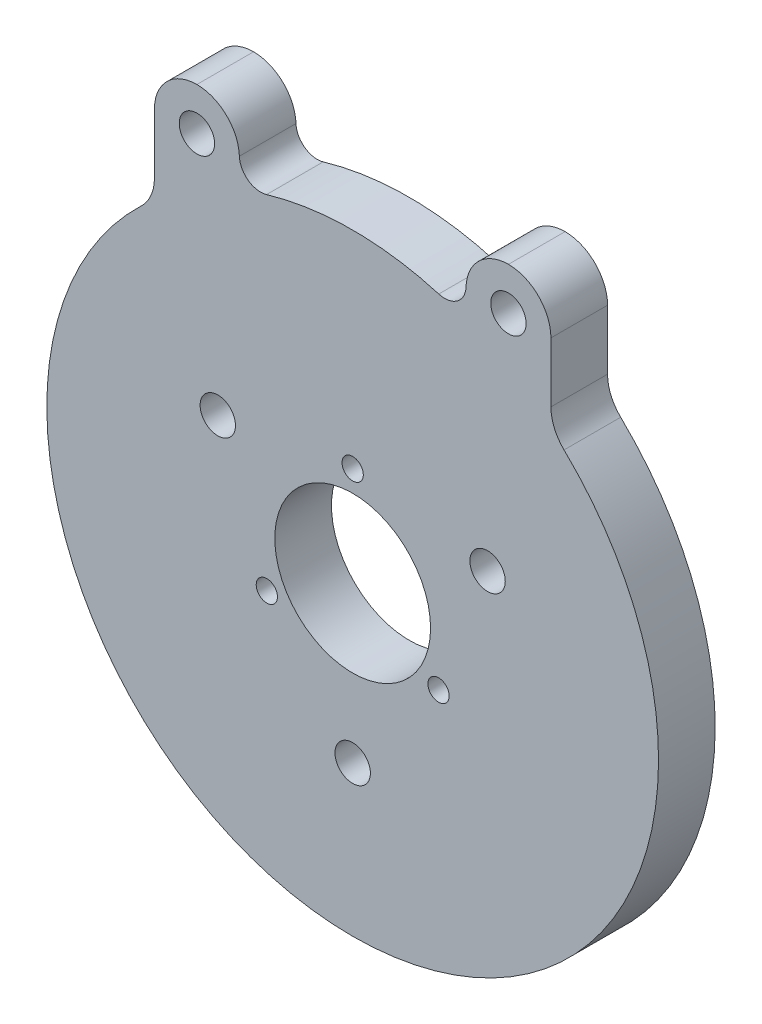
ISO-10303-21;
HEADER;
FILE_DESCRIPTION(('STEP AP214'),'2;1');
FILE_NAME('part.step','',(''),(''),'','','');
FILE_SCHEMA(('AUTOMOTIVE_DESIGN { 1 0 10303 214 1 1 1 1 }'));
ENDSEC;
DATA;
#1=APPLICATION_CONTEXT('core data for automotive mechanical design processes');
#2=APPLICATION_PROTOCOL_DEFINITION('international standard','automotive_design',2000,#1);
#3=PRODUCT_CONTEXT('',#1,'mechanical');
#4=PRODUCT('Part','Part','',(#3));
#5=PRODUCT_RELATED_PRODUCT_CATEGORY('part','',(#4));
#6=PRODUCT_DEFINITION_FORMATION('','',#4);
#7=PRODUCT_DEFINITION_CONTEXT('part definition',#1,'design');
#8=PRODUCT_DEFINITION('design','',#6,#7);
#9=PRODUCT_DEFINITION_SHAPE('','',#8);
#10=(LENGTH_UNIT() NAMED_UNIT(*) SI_UNIT(.MILLI.,.METRE.));
#11=(NAMED_UNIT(*) PLANE_ANGLE_UNIT() SI_UNIT($,.RADIAN.));
#12=(NAMED_UNIT(*) SI_UNIT($,.STERADIAN.) SOLID_ANGLE_UNIT());
#13=UNCERTAINTY_MEASURE_WITH_UNIT(LENGTH_MEASURE(1.E-05),#10,'distance_accuracy_value','');
#14=(GEOMETRIC_REPRESENTATION_CONTEXT(3) GLOBAL_UNCERTAINTY_ASSIGNED_CONTEXT((#13)) GLOBAL_UNIT_ASSIGNED_CONTEXT((#10,
#11,#12)) REPRESENTATION_CONTEXT('',''));
#15=CARTESIAN_POINT('',(0.,0.,0.));
#16=DIRECTION('',(0.,0.,1.));
#17=DIRECTION('',(1.,0.,0.));
#18=AXIS2_PLACEMENT_3D('',#15,#16,#17);
#19=CARTESIAN_POINT('',(0.,0.,4.));
#20=DIRECTION('',(0.,0.,-1.));
#21=DIRECTION('',(-1.,0.,0.));
#22=AXIS2_PLACEMENT_3D('',#19,#20,#21);
#23=CYLINDRICAL_SURFACE('',#22,21.6);
#24=CARTESIAN_POINT('',(0.,0.,0.));
#25=DIRECTION('',(0.,0.,1.));
#26=DIRECTION('',(1.,0.,0.));
#27=AXIS2_PLACEMENT_3D('',#24,#25,#26);
#28=CIRCLE('',#27,21.6);
#29=CARTESIAN_POINT('',(-14.9268292682927,15.6124875658955,0.));
#30=VERTEX_POINT('',#29);
#31=CARTESIAN_POINT('',(14.9268292682927,15.6124875658955,0.));
#32=VERTEX_POINT('',#31);
#33=EDGE_CURVE('E124',#30,#32,#28,.T.);
#34=ORIENTED_EDGE('',*,*,#33,.T.);
#35=DIRECTION('',(0.,0.,-1.));
#36=VECTOR('',#35,1.);
#37=CARTESIAN_POINT('',(14.9268292682927,15.6124875658955,4.));
#38=LINE('',#37,#36);
#39=CARTESIAN_POINT('',(14.9268292682927,15.6124875658955,4.));
#40=VERTEX_POINT('',#39);
#41=EDGE_CURVE('E130',#32,#40,#38,.F.);
#42=ORIENTED_EDGE('',*,*,#41,.T.);
#43=CARTESIAN_POINT('',(0.,0.,4.));
#44=DIRECTION('',(0.,0.,1.));
#45=DIRECTION('',(1.,0.,0.));
#46=AXIS2_PLACEMENT_3D('',#43,#44,#45);
#47=CIRCLE('',#46,21.6);
#48=CARTESIAN_POINT('',(-14.9268292682927,15.6124875658955,4.));
#49=VERTEX_POINT('',#48);
#50=EDGE_CURVE('E127',#49,#40,#47,.T.);
#51=ORIENTED_EDGE('',*,*,#50,.F.);
#52=DIRECTION('',(0.,0.,-1.));
#53=VECTOR('',#52,1.);
#54=CARTESIAN_POINT('',(-14.9268292682927,15.6124875658955,4.));
#55=LINE('',#54,#53);
#56=EDGE_CURVE('E121',#49,#30,#55,.T.);
#57=ORIENTED_EDGE('',*,*,#56,.T.);
#58=EDGE_LOOP('',(#34,#42,#51,#57));
#59=FACE_BOUND('',#58,.T.);
#60=ADVANCED_FACE('F32',(#59),#23,.T.);
#61=CARTESIAN_POINT('',(6.08077725305326,20.7264118457284,0.));
#62=VERTEX_POINT('',#61);
#63=CARTESIAN_POINT('',(-6.08077725305325,20.7264118457284,0.));
#64=VERTEX_POINT('',#63);
#65=EDGE_CURVE('E141',#62,#64,#28,.T.);
#66=ORIENTED_EDGE('',*,*,#65,.T.);
#67=DIRECTION('',(0.,0.,-1.));
#68=VECTOR('',#67,1.);
#69=CARTESIAN_POINT('',(-6.08077725305325,20.7264118457284,4.));
#70=LINE('',#69,#68);
#71=CARTESIAN_POINT('',(-6.08077725305325,20.7264118457284,4.));
#72=VERTEX_POINT('',#71);
#73=EDGE_CURVE('E151',#64,#72,#70,.F.);
#74=ORIENTED_EDGE('',*,*,#73,.T.);
#75=CARTESIAN_POINT('',(6.08077725305326,20.7264118457284,4.));
#76=VERTEX_POINT('',#75);
#77=EDGE_CURVE('E131',#76,#72,#47,.T.);
#78=ORIENTED_EDGE('',*,*,#77,.F.);
#79=DIRECTION('',(0.,0.,-1.));
#80=VECTOR('',#79,1.);
#81=CARTESIAN_POINT('',(6.08077725305326,20.7264118457284,4.));
#82=LINE('',#81,#80);
#83=EDGE_CURVE('E148',#76,#62,#82,.T.);
#84=ORIENTED_EDGE('',*,*,#83,.T.);
#85=EDGE_LOOP('',(#66,#74,#78,#84));
#86=FACE_BOUND('',#85,.T.);
#87=ADVANCED_FACE('F184',(#86),#23,.T.);
#88=CARTESIAN_POINT('',(0.,0.,4.));
#89=DIRECTION('',(0.,0.,1.));
#90=DIRECTION('',(1.,0.,0.));
#91=AXIS2_PLACEMENT_3D('',#88,#89,#90);
#92=PLANE('',#91);
#93=CARTESIAN_POINT('',(-9.52627944162887,5.49999999999991,4.));
#94=DIRECTION('',(0.,0.,1.));
#95=DIRECTION('',(-0.499999999999992,-0.866025403784443,0.));
#96=AXIS2_PLACEMENT_3D('',#93,#94,#95);
#97=CIRCLE('',#96,1.25);
#98=CARTESIAN_POINT('',(-10.1512794416289,4.41746824526936,4.));
#99=VERTEX_POINT('',#98);
#100=EDGE_CURVE('E298',#99,#99,#97,.T.);
#101=ORIENTED_EDGE('',*,*,#100,.F.);
#102=EDGE_LOOP('',(#101));
#103=FACE_BOUND('',#102,.T.);
#104=CARTESIAN_POINT('',(9.5262794416288,5.50000000000004,4.));
#105=DIRECTION('',(0.,0.,1.));
#106=DIRECTION('',(-0.500000000000004,0.866025403784436,0.));
#107=AXIS2_PLACEMENT_3D('',#104,#105,#106);
#108=CIRCLE('',#107,1.25);
#109=CARTESIAN_POINT('',(8.9012794416288,6.58253175473059,4.));
#110=VERTEX_POINT('',#109);
#111=EDGE_CURVE('E292',#110,#110,#108,.T.);
#112=ORIENTED_EDGE('',*,*,#111,.F.);
#113=EDGE_LOOP('',(#112));
#114=FACE_BOUND('',#113,.T.);
#115=CARTESIAN_POINT('',(0.,-11.,4.));
#116=DIRECTION('',(0.,0.,1.));
#117=DIRECTION('',(1.,0.,0.));
#118=AXIS2_PLACEMENT_3D('',#115,#116,#117);
#119=CIRCLE('',#118,1.25);
#120=CARTESIAN_POINT('',(1.25,-11.,4.));
#121=VERTEX_POINT('',#120);
#122=EDGE_CURVE('E286',#121,#121,#119,.T.);
#123=ORIENTED_EDGE('',*,*,#122,.F.);
#124=EDGE_LOOP('',(#123));
#125=FACE_BOUND('',#124,.T.);
#126=CARTESIAN_POINT('',(6.0621778264911,-3.49999999999994,4.));
#127=DIRECTION('',(0.,0.,1.));
#128=DIRECTION('',(-0.499999999999992,-0.866025403784443,0.));
#129=AXIS2_PLACEMENT_3D('',#126,#127,#128);
#130=CIRCLE('',#129,0.75);
#131=CARTESIAN_POINT('',(6.8121778264911,-3.49999999999994,4.));
#132=VERTEX_POINT('',#131);
#133=EDGE_CURVE('E280',#132,#132,#130,.T.);
#134=ORIENTED_EDGE('',*,*,#133,.F.);
#135=EDGE_LOOP('',(#134));
#136=FACE_BOUND('',#135,.T.);
#137=CARTESIAN_POINT('',(-6.06217782649106,-3.50000000000003,4.));
#138=DIRECTION('',(0.,0.,1.));
#139=DIRECTION('',(-0.500000000000004,0.866025403784436,0.));
#140=AXIS2_PLACEMENT_3D('',#137,#138,#139);
#141=CIRCLE('',#140,0.75);
#142=CARTESIAN_POINT('',(-5.31217782649106,-3.50000000000003,4.));
#143=VERTEX_POINT('',#142);
#144=EDGE_CURVE('E274',#143,#143,#141,.T.);
#145=ORIENTED_EDGE('',*,*,#144,.F.);
#146=EDGE_LOOP('',(#145));
#147=FACE_BOUND('',#146,.T.);
#148=CARTESIAN_POINT('',(0.,7.,4.));
#149=DIRECTION('',(0.,0.,1.));
#150=DIRECTION('',(1.,0.,0.));
#151=AXIS2_PLACEMENT_3D('',#148,#149,#150);
#152=CIRCLE('',#151,0.75);
#153=CARTESIAN_POINT('',(0.75,7.,4.));
#154=VERTEX_POINT('',#153);
#155=EDGE_CURVE('E268',#154,#154,#152,.T.);
#156=ORIENTED_EDGE('',*,*,#155,.F.);
#157=EDGE_LOOP('',(#156));
#158=FACE_BOUND('',#157,.T.);
#159=CARTESIAN_POINT('',(0.,0.,4.));
#160=DIRECTION('',(0.,0.,1.));
#161=DIRECTION('',(1.,0.,0.));
#162=AXIS2_PLACEMENT_3D('',#159,#160,#161);
#163=CIRCLE('',#162,5.5);
#164=CARTESIAN_POINT('',(5.5,0.,4.));
#165=VERTEX_POINT('',#164);
#166=EDGE_CURVE('E262',#165,#165,#163,.T.);
#167=ORIENTED_EDGE('',*,*,#166,.F.);
#168=EDGE_LOOP('',(#167));
#169=FACE_BOUND('',#168,.T.);
#170=DIRECTION('',(0.,-1.,0.));
#171=VECTOR('',#170,1.);
#172=CARTESIAN_POINT('',(14.,-48.4149446548446,4.));
#173=LINE('',#172,#171);
#174=CARTESIAN_POINT('',(14.,21.9999999999999,4.));
#175=VERTEX_POINT('',#174);
#176=CARTESIAN_POINT('',(14.,17.7808886167143,4.));
#177=VERTEX_POINT('',#176);
#178=EDGE_CURVE('E203',#175,#177,#173,.T.);
#179=ORIENTED_EDGE('',*,*,#178,.F.);
#180=CARTESIAN_POINT('',(11.,21.9999999999999,4.));
#181=DIRECTION('',(0.,0.,1.));
#182=DIRECTION('',(1.,0.,0.));
#183=AXIS2_PLACEMENT_3D('',#180,#181,#182);
#184=CIRCLE('',#183,3.);
#185=CARTESIAN_POINT('',(11.,24.9999999999999,4.));
#186=VERTEX_POINT('',#185);
#187=EDGE_CURVE('E229',#175,#186,#184,.T.);
#188=ORIENTED_EDGE('',*,*,#187,.T.);
#189=CARTESIAN_POINT('',(11.,21.9999999999999,4.));
#190=DIRECTION('',(0.,0.,1.));
#191=DIRECTION('',(1.,0.,0.));
#192=AXIS2_PLACEMENT_3D('',#189,#190,#191);
#193=CIRCLE('',#192,3.);
#194=CARTESIAN_POINT('',(8.00203563412131,22.1104973344545,4.));
#195=VERTEX_POINT('',#194);
#196=EDGE_CURVE('E181',#186,#195,#193,.T.);
#197=ORIENTED_EDGE('',*,*,#196,.T.);
#198=CARTESIAN_POINT('',(6.50305345118196,22.1657460016818,4.));
#199=DIRECTION('',(0.,0.,1.));
#200=DIRECTION('',(1.,0.,0.));
#201=AXIS2_PLACEMENT_3D('',#198,#199,#200);
#202=CIRCLE('',#201,1.5);
#203=EDGE_CURVE('E40',#195,#76,#202,.F.);
#204=ORIENTED_EDGE('',*,*,#203,.T.);
#205=ORIENTED_EDGE('',*,*,#77,.T.);
#206=CARTESIAN_POINT('',(-6.50305345118195,22.1657460016818,4.));
#207=DIRECTION('',(0.,0.,1.));
#208=DIRECTION('',(1.,0.,0.));
#209=AXIS2_PLACEMENT_3D('',#206,#207,#208);
#210=CIRCLE('',#209,1.5);
#211=CARTESIAN_POINT('',(-8.0020356341213,22.1104973344545,4.));
#212=VERTEX_POINT('',#211);
#213=EDGE_CURVE('E170',#72,#212,#210,.F.);
#214=ORIENTED_EDGE('',*,*,#213,.T.);
#215=CARTESIAN_POINT('',(-11.,21.9999999999999,4.));
#216=DIRECTION('',(0.,0.,1.));
#217=DIRECTION('',(1.,0.,0.));
#218=AXIS2_PLACEMENT_3D('',#215,#216,#217);
#219=CIRCLE('',#218,3.);
#220=CARTESIAN_POINT('',(-11.,24.9999999999999,4.));
#221=VERTEX_POINT('',#220);
#222=EDGE_CURVE('E226',#212,#221,#219,.T.);
#223=ORIENTED_EDGE('',*,*,#222,.T.);
#224=CARTESIAN_POINT('',(-11.,21.9999999999999,4.));
#225=DIRECTION('',(0.,0.,1.));
#226=DIRECTION('',(1.,0.,0.));
#227=AXIS2_PLACEMENT_3D('',#224,#225,#226);
#228=CIRCLE('',#227,3.);
#229=CARTESIAN_POINT('',(-14.,21.9999999999999,4.));
#230=VERTEX_POINT('',#229);
#231=EDGE_CURVE('E224',#221,#230,#228,.T.);
#232=ORIENTED_EDGE('',*,*,#231,.T.);
#233=DIRECTION('',(0.,1.,0.));
#234=VECTOR('',#233,1.);
#235=CARTESIAN_POINT('',(-14.,-48.4149446548446,4.));
#236=LINE('',#235,#234);
#237=CARTESIAN_POINT('',(-14.,17.7808886167143,4.));
#238=VERTEX_POINT('',#237);
#239=EDGE_CURVE('E252',#238,#230,#236,.T.);
#240=ORIENTED_EDGE('',*,*,#239,.F.);
#241=CARTESIAN_POINT('',(-17.,17.7808886167143,4.));
#242=DIRECTION('',(0.,0.,1.));
#243=DIRECTION('',(1.,0.,0.));
#244=AXIS2_PLACEMENT_3D('',#241,#242,#243);
#245=CIRCLE('',#244,3.);
#246=EDGE_CURVE('E149',#238,#49,#245,.F.);
#247=ORIENTED_EDGE('',*,*,#246,.T.);
#248=ORIENTED_EDGE('',*,*,#50,.T.);
#249=CARTESIAN_POINT('',(17.,17.7808886167143,4.));
#250=DIRECTION('',(0.,0.,1.));
#251=DIRECTION('',(1.,0.,0.));
#252=AXIS2_PLACEMENT_3D('',#249,#250,#251);
#253=CIRCLE('',#252,3.);
#254=EDGE_CURVE('E195',#40,#177,#253,.F.);
#255=ORIENTED_EDGE('',*,*,#254,.T.);
#256=EDGE_LOOP('',(#179,#188,#197,#204,#205,#214,#223,#232,#240,#247,#248,#255));
#257=FACE_BOUND('',#256,.T.);
#258=CARTESIAN_POINT('',(11.,21.9999999999999,4.));
#259=DIRECTION('',(0.,0.,1.));
#260=DIRECTION('',(1.,0.,0.));
#261=AXIS2_PLACEMENT_3D('',#258,#259,#260);
#262=CIRCLE('',#261,1.25);
#263=CARTESIAN_POINT('',(12.25,21.9999999999999,4.));
#264=VERTEX_POINT('',#263);
#265=EDGE_CURVE('E142',#264,#264,#262,.T.);
#266=ORIENTED_EDGE('',*,*,#265,.F.);
#267=EDGE_LOOP('',(#266));
#268=FACE_BOUND('',#267,.T.);
#269=CARTESIAN_POINT('',(-11.,21.9999999999999,4.));
#270=DIRECTION('',(0.,0.,1.));
#271=DIRECTION('',(1.,0.,0.));
#272=AXIS2_PLACEMENT_3D('',#269,#270,#271);
#273=CIRCLE('',#272,1.25);
#274=CARTESIAN_POINT('',(-9.74999999999999,21.9999999999999,4.));
#275=VERTEX_POINT('',#274);
#276=EDGE_CURVE('E159',#275,#275,#273,.T.);
#277=ORIENTED_EDGE('',*,*,#276,.F.);
#278=EDGE_LOOP('',(#277));
#279=FACE_BOUND('',#278,.T.);
#280=ADVANCED_FACE('F178',(#103,#114,#125,#136,#147,#158,#169,#257,#268,#279),#92,.T.);
#281=CARTESIAN_POINT('',(0.,0.,0.));
#282=DIRECTION('',(0.,0.,1.));
#283=DIRECTION('',(1.,0.,0.));
#284=AXIS2_PLACEMENT_3D('',#281,#282,#283);
#285=PLANE('',#284);
#286=CARTESIAN_POINT('',(-9.52627944162887,5.49999999999991,0.));
#287=DIRECTION('',(0.,0.,1.));
#288=DIRECTION('',(1.,0.,0.));
#289=AXIS2_PLACEMENT_3D('',#286,#287,#288);
#290=CIRCLE('',#289,1.25);
#291=CARTESIAN_POINT('',(-8.27627944162887,5.49999999999991,0.));
#292=VERTEX_POINT('',#291);
#293=EDGE_CURVE('E295',#292,#292,#290,.F.);
#294=ORIENTED_EDGE('',*,*,#293,.F.);
#295=EDGE_LOOP('',(#294));
#296=FACE_BOUND('',#295,.T.);
#297=CARTESIAN_POINT('',(9.5262794416288,5.50000000000004,0.));
#298=DIRECTION('',(0.,0.,1.));
#299=DIRECTION('',(1.,0.,0.));
#300=AXIS2_PLACEMENT_3D('',#297,#298,#299);
#301=CIRCLE('',#300,1.25);
#302=CARTESIAN_POINT('',(10.7762794416288,5.50000000000004,0.));
#303=VERTEX_POINT('',#302);
#304=EDGE_CURVE('E289',#303,#303,#301,.F.);
#305=ORIENTED_EDGE('',*,*,#304,.F.);
#306=EDGE_LOOP('',(#305));
#307=FACE_BOUND('',#306,.T.);
#308=CARTESIAN_POINT('',(0.,-11.,0.));
#309=DIRECTION('',(0.,0.,1.));
#310=DIRECTION('',(1.,0.,0.));
#311=AXIS2_PLACEMENT_3D('',#308,#309,#310);
#312=CIRCLE('',#311,1.25);
#313=CARTESIAN_POINT('',(1.25,-11.,0.));
#314=VERTEX_POINT('',#313);
#315=EDGE_CURVE('E283',#314,#314,#312,.F.);
#316=ORIENTED_EDGE('',*,*,#315,.F.);
#317=EDGE_LOOP('',(#316));
#318=FACE_BOUND('',#317,.T.);
#319=CARTESIAN_POINT('',(6.0621778264911,-3.49999999999994,0.));
#320=DIRECTION('',(0.,0.,1.));
#321=DIRECTION('',(1.,0.,0.));
#322=AXIS2_PLACEMENT_3D('',#319,#320,#321);
#323=CIRCLE('',#322,0.75);
#324=CARTESIAN_POINT('',(6.8121778264911,-3.49999999999994,0.));
#325=VERTEX_POINT('',#324);
#326=EDGE_CURVE('E277',#325,#325,#323,.F.);
#327=ORIENTED_EDGE('',*,*,#326,.F.);
#328=EDGE_LOOP('',(#327));
#329=FACE_BOUND('',#328,.T.);
#330=CARTESIAN_POINT('',(-6.06217782649106,-3.50000000000003,0.));
#331=DIRECTION('',(0.,0.,1.));
#332=DIRECTION('',(1.,0.,0.));
#333=AXIS2_PLACEMENT_3D('',#330,#331,#332);
#334=CIRCLE('',#333,0.75);
#335=CARTESIAN_POINT('',(-5.31217782649106,-3.50000000000003,0.));
#336=VERTEX_POINT('',#335);
#337=EDGE_CURVE('E271',#336,#336,#334,.F.);
#338=ORIENTED_EDGE('',*,*,#337,.F.);
#339=EDGE_LOOP('',(#338));
#340=FACE_BOUND('',#339,.T.);
#341=CARTESIAN_POINT('',(0.,7.,0.));
#342=DIRECTION('',(0.,0.,1.));
#343=DIRECTION('',(1.,0.,0.));
#344=AXIS2_PLACEMENT_3D('',#341,#342,#343);
#345=CIRCLE('',#344,0.75);
#346=CARTESIAN_POINT('',(0.75,7.,0.));
#347=VERTEX_POINT('',#346);
#348=EDGE_CURVE('E265',#347,#347,#345,.F.);
#349=ORIENTED_EDGE('',*,*,#348,.F.);
#350=EDGE_LOOP('',(#349));
#351=FACE_BOUND('',#350,.T.);
#352=CARTESIAN_POINT('',(0.,0.,0.));
#353=DIRECTION('',(0.,0.,1.));
#354=DIRECTION('',(1.,0.,0.));
#355=AXIS2_PLACEMENT_3D('',#352,#353,#354);
#356=CIRCLE('',#355,5.5);
#357=CARTESIAN_POINT('',(5.5,0.,0.));
#358=VERTEX_POINT('',#357);
#359=EDGE_CURVE('E162',#358,#358,#356,.F.);
#360=ORIENTED_EDGE('',*,*,#359,.F.);
#361=EDGE_LOOP('',(#360));
#362=FACE_BOUND('',#361,.T.);
#363=ORIENTED_EDGE('',*,*,#65,.F.);
#364=CARTESIAN_POINT('',(6.50305345118196,22.1657460016818,0.));
#365=DIRECTION('',(0.,0.,1.));
#366=DIRECTION('',(1.,0.,0.));
#367=AXIS2_PLACEMENT_3D('',#364,#365,#366);
#368=CIRCLE('',#367,1.5);
#369=CARTESIAN_POINT('',(8.00203563412131,22.1104973344545,0.));
#370=VERTEX_POINT('',#369);
#371=EDGE_CURVE('E11',#62,#370,#368,.T.);
#372=ORIENTED_EDGE('',*,*,#371,.T.);
#373=CARTESIAN_POINT('',(11.,21.9999999999999,0.));
#374=DIRECTION('',(0.,0.,1.));
#375=DIRECTION('',(1.,0.,0.));
#376=AXIS2_PLACEMENT_3D('',#373,#374,#375);
#377=CIRCLE('',#376,3.);
#378=CARTESIAN_POINT('',(11.,24.9999999999999,0.));
#379=VERTEX_POINT('',#378);
#380=EDGE_CURVE('E190',#370,#379,#377,.F.);
#381=ORIENTED_EDGE('',*,*,#380,.T.);
#382=CARTESIAN_POINT('',(11.,21.9999999999999,0.));
#383=DIRECTION('',(0.,0.,1.));
#384=DIRECTION('',(1.,0.,0.));
#385=AXIS2_PLACEMENT_3D('',#382,#383,#384);
#386=CIRCLE('',#385,3.);
#387=CARTESIAN_POINT('',(14.,21.9999999999999,0.));
#388=VERTEX_POINT('',#387);
#389=EDGE_CURVE('E192',#379,#388,#386,.F.);
#390=ORIENTED_EDGE('',*,*,#389,.T.);
#391=DIRECTION('',(0.,1.,0.));
#392=VECTOR('',#391,1.);
#393=CARTESIAN_POINT('',(14.,-48.4149446548446,0.));
#394=LINE('',#393,#392);
#395=CARTESIAN_POINT('',(14.,17.7808886167143,0.));
#396=VERTEX_POINT('',#395);
#397=EDGE_CURVE('E214',#396,#388,#394,.T.);
#398=ORIENTED_EDGE('',*,*,#397,.F.);
#399=CARTESIAN_POINT('',(17.,17.7808886167143,0.));
#400=DIRECTION('',(0.,0.,1.));
#401=DIRECTION('',(1.,0.,0.));
#402=AXIS2_PLACEMENT_3D('',#399,#400,#401);
#403=CIRCLE('',#402,3.);
#404=EDGE_CURVE('E140',#396,#32,#403,.T.);
#405=ORIENTED_EDGE('',*,*,#404,.T.);
#406=ORIENTED_EDGE('',*,*,#33,.F.);
#407=CARTESIAN_POINT('',(-17.,17.7808886167143,0.));
#408=DIRECTION('',(0.,0.,1.));
#409=DIRECTION('',(1.,0.,0.));
#410=AXIS2_PLACEMENT_3D('',#407,#408,#409);
#411=CIRCLE('',#410,3.);
#412=CARTESIAN_POINT('',(-14.,17.7808886167143,0.));
#413=VERTEX_POINT('',#412);
#414=EDGE_CURVE('E136',#30,#413,#411,.T.);
#415=ORIENTED_EDGE('',*,*,#414,.T.);
#416=DIRECTION('',(0.,-1.,0.));
#417=VECTOR('',#416,1.);
#418=CARTESIAN_POINT('',(-14.,-48.4149446548446,0.));
#419=LINE('',#418,#417);
#420=CARTESIAN_POINT('',(-14.,21.9999999999999,0.));
#421=VERTEX_POINT('',#420);
#422=EDGE_CURVE('E234',#421,#413,#419,.T.);
#423=ORIENTED_EDGE('',*,*,#422,.F.);
#424=CARTESIAN_POINT('',(-11.,21.9999999999999,0.));
#425=DIRECTION('',(0.,0.,1.));
#426=DIRECTION('',(1.,0.,0.));
#427=AXIS2_PLACEMENT_3D('',#424,#425,#426);
#428=CIRCLE('',#427,3.);
#429=CARTESIAN_POINT('',(-11.,24.9999999999999,0.));
#430=VERTEX_POINT('',#429);
#431=EDGE_CURVE('E198',#421,#430,#428,.F.);
#432=ORIENTED_EDGE('',*,*,#431,.T.);
#433=CARTESIAN_POINT('',(-11.,21.9999999999999,0.));
#434=DIRECTION('',(0.,0.,1.));
#435=DIRECTION('',(1.,0.,0.));
#436=AXIS2_PLACEMENT_3D('',#433,#434,#435);
#437=CIRCLE('',#436,3.);
#438=CARTESIAN_POINT('',(-8.0020356341213,22.1104973344545,0.));
#439=VERTEX_POINT('',#438);
#440=EDGE_CURVE('E193',#430,#439,#437,.F.);
#441=ORIENTED_EDGE('',*,*,#440,.T.);
#442=CARTESIAN_POINT('',(-6.50305345118195,22.1657460016818,0.));
#443=DIRECTION('',(0.,0.,1.));
#444=DIRECTION('',(1.,0.,0.));
#445=AXIS2_PLACEMENT_3D('',#442,#443,#444);
#446=CIRCLE('',#445,1.5);
#447=EDGE_CURVE('E172',#439,#64,#446,.T.);
#448=ORIENTED_EDGE('',*,*,#447,.T.);
#449=EDGE_LOOP('',(#363,#372,#381,#390,#398,#405,#406,#415,#423,#432,#441,#448));
#450=FACE_BOUND('',#449,.T.);
#451=CARTESIAN_POINT('',(11.,21.9999999999999,0.));
#452=DIRECTION('',(0.,0.,1.));
#453=DIRECTION('',(1.,0.,0.));
#454=AXIS2_PLACEMENT_3D('',#451,#452,#453);
#455=CIRCLE('',#454,1.25);
#456=CARTESIAN_POINT('',(12.25,21.9999999999999,0.));
#457=VERTEX_POINT('',#456);
#458=EDGE_CURVE('E213',#457,#457,#455,.F.);
#459=ORIENTED_EDGE('',*,*,#458,.F.);
#460=EDGE_LOOP('',(#459));
#461=FACE_BOUND('',#460,.T.);
#462=CARTESIAN_POINT('',(-11.,21.9999999999999,0.));
#463=DIRECTION('',(0.,0.,1.));
#464=DIRECTION('',(1.,0.,0.));
#465=AXIS2_PLACEMENT_3D('',#462,#463,#464);
#466=CIRCLE('',#465,1.25);
#467=CARTESIAN_POINT('',(-9.74999999999999,21.9999999999999,0.));
#468=VERTEX_POINT('',#467);
#469=EDGE_CURVE('E247',#468,#468,#466,.F.);
#470=ORIENTED_EDGE('',*,*,#469,.F.);
#471=EDGE_LOOP('',(#470));
#472=FACE_BOUND('',#471,.T.);
#473=ADVANCED_FACE('F133',(#296,#307,#318,#329,#340,#351,#362,#450,#461,#472),#285,.F.);
#474=CARTESIAN_POINT('',(14.,-48.4149446548446,-10.4462716890724));
#475=DIRECTION('',(-1.,0.,0.));
#476=DIRECTION('',(0.,-1.,0.));
#477=AXIS2_PLACEMENT_3D('',#474,#475,#476);
#478=PLANE('',#477);
#479=ORIENTED_EDGE('',*,*,#178,.T.);
#480=DIRECTION('',(0.,0.,1.));
#481=VECTOR('',#480,1.);
#482=CARTESIAN_POINT('',(14.,17.7808886167143,0.));
#483=LINE('',#482,#481);
#484=EDGE_CURVE('E210',#177,#396,#483,.F.);
#485=ORIENTED_EDGE('',*,*,#484,.T.);
#486=ORIENTED_EDGE('',*,*,#397,.T.);
#487=DIRECTION('',(0.,0.,1.));
#488=VECTOR('',#487,1.);
#489=CARTESIAN_POINT('',(14.,21.9999999999999,4.));
#490=LINE('',#489,#488);
#491=EDGE_CURVE('E212',#388,#175,#490,.T.);
#492=ORIENTED_EDGE('',*,*,#491,.T.);
#493=EDGE_LOOP('',(#479,#485,#486,#492));
#494=FACE_BOUND('',#493,.T.);
#495=ADVANCED_FACE('F208',(#494),#478,.F.);
#496=CARTESIAN_POINT('',(11.,21.9999999999999,-10.4462716890724));
#497=DIRECTION('',(0.,0.,1.));
#498=DIRECTION('',(1.,0.,0.));
#499=AXIS2_PLACEMENT_3D('',#496,#497,#498);
#500=CYLINDRICAL_SURFACE('',#499,1.25);
#501=ORIENTED_EDGE('',*,*,#458,.T.);
#502=EDGE_LOOP('',(#501));
#503=FACE_BOUND('',#502,.T.);
#504=ORIENTED_EDGE('',*,*,#265,.T.);
#505=EDGE_LOOP('',(#504));
#506=FACE_BOUND('',#505,.T.);
#507=ADVANCED_FACE('F463',(#503,#506),#500,.F.);
#508=CARTESIAN_POINT('',(-11.,21.9999999999999,-10.4462716890724));
#509=DIRECTION('',(0.,0.,1.));
#510=DIRECTION('',(1.,0.,0.));
#511=AXIS2_PLACEMENT_3D('',#508,#509,#510);
#512=CYLINDRICAL_SURFACE('',#511,1.25);
#513=ORIENTED_EDGE('',*,*,#469,.T.);
#514=EDGE_LOOP('',(#513));
#515=FACE_BOUND('',#514,.T.);
#516=ORIENTED_EDGE('',*,*,#276,.T.);
#517=EDGE_LOOP('',(#516));
#518=FACE_BOUND('',#517,.T.);
#519=ADVANCED_FACE('F470',(#515,#518),#512,.F.);
#520=CARTESIAN_POINT('',(-14.,-48.4149446548446,-10.4462716890724));
#521=DIRECTION('',(1.,0.,0.));
#522=DIRECTION('',(0.,0.,-1.));
#523=AXIS2_PLACEMENT_3D('',#520,#521,#522);
#524=PLANE('',#523);
#525=ORIENTED_EDGE('',*,*,#422,.T.);
#526=DIRECTION('',(0.,0.,1.));
#527=VECTOR('',#526,1.);
#528=CARTESIAN_POINT('',(-14.,17.7808886167143,4.));
#529=LINE('',#528,#527);
#530=EDGE_CURVE('E147',#413,#238,#529,.T.);
#531=ORIENTED_EDGE('',*,*,#530,.T.);
#532=ORIENTED_EDGE('',*,*,#239,.T.);
#533=DIRECTION('',(0.,0.,1.));
#534=VECTOR('',#533,1.);
#535=CARTESIAN_POINT('',(-14.,21.9999999999999,-10.4462716890724));
#536=LINE('',#535,#534);
#537=EDGE_CURVE('E217',#230,#421,#536,.F.);
#538=ORIENTED_EDGE('',*,*,#537,.T.);
#539=EDGE_LOOP('',(#525,#531,#532,#538));
#540=FACE_BOUND('',#539,.T.);
#541=ADVANCED_FACE('F341',(#540),#524,.F.);
#542=CARTESIAN_POINT('',(17.,17.7808886167143,4.));
#543=DIRECTION('',(0.,0.,-1.));
#544=DIRECTION('',(-1.,0.,0.));
#545=AXIS2_PLACEMENT_3D('',#542,#543,#544);
#546=CYLINDRICAL_SURFACE('',#545,3.);
#547=ORIENTED_EDGE('',*,*,#404,.F.);
#548=ORIENTED_EDGE('',*,*,#484,.F.);
#549=ORIENTED_EDGE('',*,*,#254,.F.);
#550=ORIENTED_EDGE('',*,*,#41,.F.);
#551=EDGE_LOOP('',(#547,#548,#549,#550));
#552=FACE_BOUND('',#551,.T.);
#553=ADVANCED_FACE('F216',(#552),#546,.F.);
#554=CARTESIAN_POINT('',(-17.,17.7808886167143,4.));
#555=DIRECTION('',(0.,0.,-1.));
#556=DIRECTION('',(-1.,0.,0.));
#557=AXIS2_PLACEMENT_3D('',#554,#555,#556);
#558=CYLINDRICAL_SURFACE('',#557,3.);
#559=ORIENTED_EDGE('',*,*,#414,.F.);
#560=ORIENTED_EDGE('',*,*,#56,.F.);
#561=ORIENTED_EDGE('',*,*,#246,.F.);
#562=ORIENTED_EDGE('',*,*,#530,.F.);
#563=EDGE_LOOP('',(#559,#560,#561,#562));
#564=FACE_BOUND('',#563,.T.);
#565=ADVANCED_FACE('F145',(#564),#558,.F.);
#566=CARTESIAN_POINT('',(11.,21.9999999999999,-10.4462716890724));
#567=DIRECTION('',(0.,0.,1.));
#568=DIRECTION('',(1.,0.,0.));
#569=AXIS2_PLACEMENT_3D('',#566,#567,#568);
#570=CYLINDRICAL_SURFACE('',#569,3.);
#571=ORIENTED_EDGE('',*,*,#380,.F.);
#572=DIRECTION('',(0.,0.,1.));
#573=VECTOR('',#572,1.);
#574=CARTESIAN_POINT('',(8.00203563412131,22.1104973344545,-10.4462716890724));
#575=LINE('',#574,#573);
#576=EDGE_CURVE('E168',#370,#195,#575,.T.);
#577=ORIENTED_EDGE('',*,*,#576,.T.);
#578=ORIENTED_EDGE('',*,*,#196,.F.);
#579=DIRECTION('',(0.,0.,1.));
#580=VECTOR('',#579,1.);
#581=CARTESIAN_POINT('',(11.,24.9999999999999,-10.4462716890724));
#582=LINE('',#581,#580);
#583=EDGE_CURVE('E156',#379,#186,#582,.T.);
#584=ORIENTED_EDGE('',*,*,#583,.F.);
#585=EDGE_LOOP('',(#571,#577,#578,#584));
#586=FACE_BOUND('',#585,.T.);
#587=ADVANCED_FACE('F188',(#586),#570,.T.);
#588=CARTESIAN_POINT('',(11.,21.9999999999999,-10.4462716890724));
#589=DIRECTION('',(0.,0.,-1.));
#590=DIRECTION('',(-1.,0.,0.));
#591=AXIS2_PLACEMENT_3D('',#588,#589,#590);
#592=CYLINDRICAL_SURFACE('',#591,3.);
#593=ORIENTED_EDGE('',*,*,#389,.F.);
#594=ORIENTED_EDGE('',*,*,#583,.T.);
#595=ORIENTED_EDGE('',*,*,#187,.F.);
#596=ORIENTED_EDGE('',*,*,#491,.F.);
#597=EDGE_LOOP('',(#593,#594,#595,#596));
#598=FACE_BOUND('',#597,.T.);
#599=ADVANCED_FACE('F344',(#598),#592,.T.);
#600=CARTESIAN_POINT('',(-11.,21.9999999999999,-10.4462716890724));
#601=DIRECTION('',(0.,0.,1.));
#602=DIRECTION('',(1.,0.,0.));
#603=AXIS2_PLACEMENT_3D('',#600,#601,#602);
#604=CYLINDRICAL_SURFACE('',#603,3.);
#605=DIRECTION('',(0.,0.,1.));
#606=VECTOR('',#605,1.);
#607=CARTESIAN_POINT('',(-11.,24.9999999999999,-10.4462716890724));
#608=LINE('',#607,#606);
#609=EDGE_CURVE('E160',#430,#221,#608,.T.);
#610=ORIENTED_EDGE('',*,*,#609,.F.);
#611=ORIENTED_EDGE('',*,*,#431,.F.);
#612=ORIENTED_EDGE('',*,*,#537,.F.);
#613=ORIENTED_EDGE('',*,*,#231,.F.);
#614=EDGE_LOOP('',(#610,#611,#612,#613));
#615=FACE_BOUND('',#614,.T.);
#616=ADVANCED_FACE('F238',(#615),#604,.T.);
#617=CARTESIAN_POINT('',(-11.,21.9999999999999,-10.4462716890724));
#618=DIRECTION('',(0.,0.,1.));
#619=DIRECTION('',(1.,0.,0.));
#620=AXIS2_PLACEMENT_3D('',#617,#618,#619);
#621=CYLINDRICAL_SURFACE('',#620,3.);
#622=ORIENTED_EDGE('',*,*,#222,.F.);
#623=DIRECTION('',(0.,0.,1.));
#624=VECTOR('',#623,1.);
#625=CARTESIAN_POINT('',(-8.0020356341213,22.1104973344545,-10.4462716890724));
#626=LINE('',#625,#624);
#627=EDGE_CURVE('E166',#212,#439,#626,.F.);
#628=ORIENTED_EDGE('',*,*,#627,.T.);
#629=ORIENTED_EDGE('',*,*,#440,.F.);
#630=ORIENTED_EDGE('',*,*,#609,.T.);
#631=EDGE_LOOP('',(#622,#628,#629,#630));
#632=FACE_BOUND('',#631,.T.);
#633=ADVANCED_FACE('F241',(#632),#621,.T.);
#634=CARTESIAN_POINT('',(-6.50305345118195,22.1657460016818,-10.4462716890724));
#635=DIRECTION('',(0.,0.,-1.));
#636=DIRECTION('',(-1.,0.,0.));
#637=AXIS2_PLACEMENT_3D('',#634,#635,#636);
#638=CYLINDRICAL_SURFACE('',#637,1.5);
#639=ORIENTED_EDGE('',*,*,#447,.F.);
#640=ORIENTED_EDGE('',*,*,#627,.F.);
#641=ORIENTED_EDGE('',*,*,#213,.F.);
#642=ORIENTED_EDGE('',*,*,#73,.F.);
#643=EDGE_LOOP('',(#639,#640,#641,#642));
#644=FACE_BOUND('',#643,.T.);
#645=ADVANCED_FACE('F244',(#644),#638,.F.);
#646=CARTESIAN_POINT('',(6.50305345118196,22.1657460016818,4.));
#647=DIRECTION('',(0.,0.,-1.));
#648=DIRECTION('',(-1.,0.,0.));
#649=AXIS2_PLACEMENT_3D('',#646,#647,#648);
#650=CYLINDRICAL_SURFACE('',#649,1.5);
#651=ORIENTED_EDGE('',*,*,#371,.F.);
#652=ORIENTED_EDGE('',*,*,#83,.F.);
#653=ORIENTED_EDGE('',*,*,#203,.F.);
#654=ORIENTED_EDGE('',*,*,#576,.F.);
#655=EDGE_LOOP('',(#651,#652,#653,#654));
#656=FACE_BOUND('',#655,.T.);
#657=ADVANCED_FACE('F34',(#656),#650,.F.);
#658=CARTESIAN_POINT('',(0.,0.,-15.556349186104));
#659=DIRECTION('',(0.,0.,1.));
#660=DIRECTION('',(1.,0.,0.));
#661=AXIS2_PLACEMENT_3D('',#658,#659,#660);
#662=CYLINDRICAL_SURFACE('',#661,5.5);
#663=ORIENTED_EDGE('',*,*,#359,.T.);
#664=EDGE_LOOP('',(#663));
#665=FACE_BOUND('',#664,.T.);
#666=ORIENTED_EDGE('',*,*,#166,.T.);
#667=EDGE_LOOP('',(#666));
#668=FACE_BOUND('',#667,.T.);
#669=ADVANCED_FACE('F319',(#665,#668),#662,.F.);
#670=CARTESIAN_POINT('',(0.,7.,-2.12132034355964));
#671=DIRECTION('',(0.,0.,1.));
#672=DIRECTION('',(1.,0.,0.));
#673=AXIS2_PLACEMENT_3D('',#670,#671,#672);
#674=CYLINDRICAL_SURFACE('',#673,0.75);
#675=ORIENTED_EDGE('',*,*,#348,.T.);
#676=EDGE_LOOP('',(#675));
#677=FACE_BOUND('',#676,.T.);
#678=ORIENTED_EDGE('',*,*,#155,.T.);
#679=EDGE_LOOP('',(#678));
#680=FACE_BOUND('',#679,.T.);
#681=ADVANCED_FACE('F321',(#677,#680),#674,.F.);
#682=CARTESIAN_POINT('',(-6.06217782649106,-3.50000000000003,-2.12132034355964));
#683=DIRECTION('',(0.,0.,1.));
#684=DIRECTION('',(1.,0.,0.));
#685=AXIS2_PLACEMENT_3D('',#682,#683,#684);
#686=CYLINDRICAL_SURFACE('',#685,0.75);
#687=CARTESIAN_POINT('',(-5.31217782649106,-3.50000000000003,0.));
#688=CARTESIAN_POINT('',(-5.31217782649106,-3.50000000000003,0.0416666666666662));
#689=CARTESIAN_POINT('',(-5.31217782649106,-3.50000000000003,0.083333333333333));
#690=CARTESIAN_POINT('',(-5.31217782649106,-3.50000000000003,0.166666666666666));
#691=CARTESIAN_POINT('',(-5.31217782649106,-3.50000000000003,0.208333333333333));
#692=CARTESIAN_POINT('',(-5.31217782649106,-3.50000000000003,0.291666666666666));
#693=CARTESIAN_POINT('',(-5.31217782649106,-3.50000000000003,0.333333333333333));
#694=CARTESIAN_POINT('',(-5.31217782649106,-3.50000000000003,0.416666666666666));
#695=CARTESIAN_POINT('',(-5.31217782649106,-3.50000000000003,0.458333333333333));
#696=CARTESIAN_POINT('',(-5.31217782649106,-3.50000000000003,0.541666666666666));
#697=CARTESIAN_POINT('',(-5.31217782649106,-3.50000000000003,0.583333333333333));
#698=CARTESIAN_POINT('',(-5.31217782649106,-3.50000000000003,0.666666666666666));
#699=CARTESIAN_POINT('',(-5.31217782649106,-3.50000000000003,0.708333333333333));
#700=CARTESIAN_POINT('',(-5.31217782649106,-3.50000000000003,0.791666666666666));
#701=CARTESIAN_POINT('',(-5.31217782649106,-3.50000000000003,0.833333333333333));
#702=CARTESIAN_POINT('',(-5.31217782649106,-3.50000000000003,0.916666666666666));
#703=CARTESIAN_POINT('',(-5.31217782649106,-3.50000000000003,0.958333333333333));
#704=CARTESIAN_POINT('',(-5.31217782649106,-3.50000000000003,1.04166666666667));
#705=CARTESIAN_POINT('',(-5.31217782649106,-3.50000000000003,1.08333333333333));
#706=CARTESIAN_POINT('',(-5.31217782649106,-3.50000000000003,1.16666666666667));
#707=CARTESIAN_POINT('',(-5.31217782649106,-3.50000000000003,1.20833333333333));
#708=CARTESIAN_POINT('',(-5.31217782649106,-3.50000000000003,1.29166666666667));
#709=CARTESIAN_POINT('',(-5.31217782649106,-3.50000000000003,1.33333333333333));
#710=CARTESIAN_POINT('',(-5.31217782649106,-3.50000000000003,1.41666666666667));
#711=CARTESIAN_POINT('',(-5.31217782649106,-3.50000000000003,1.45833333333333));
#712=CARTESIAN_POINT('',(-5.31217782649106,-3.50000000000003,1.54166666666667));
#713=CARTESIAN_POINT('',(-5.31217782649106,-3.50000000000003,1.58333333333333));
#714=CARTESIAN_POINT('',(-5.31217782649106,-3.50000000000003,1.66666666666667));
#715=CARTESIAN_POINT('',(-5.31217782649106,-3.50000000000003,1.70833333333333));
#716=CARTESIAN_POINT('',(-5.31217782649106,-3.50000000000003,1.79166666666667));
#717=CARTESIAN_POINT('',(-5.31217782649106,-3.50000000000003,1.83333333333333));
#718=CARTESIAN_POINT('',(-5.31217782649106,-3.50000000000003,1.91666666666667));
#719=CARTESIAN_POINT('',(-5.31217782649106,-3.50000000000003,1.95833333333333));
#720=CARTESIAN_POINT('',(-5.31217782649106,-3.50000000000003,2.04166666666667));
#721=CARTESIAN_POINT('',(-5.31217782649106,-3.50000000000003,2.08333333333333));
#722=CARTESIAN_POINT('',(-5.31217782649106,-3.50000000000003,2.16666666666667));
#723=CARTESIAN_POINT('',(-5.31217782649106,-3.50000000000003,2.20833333333333));
#724=CARTESIAN_POINT('',(-5.31217782649106,-3.50000000000003,2.29166666666667));
#725=CARTESIAN_POINT('',(-5.31217782649106,-3.50000000000003,2.33333333333333));
#726=CARTESIAN_POINT('',(-5.31217782649106,-3.50000000000003,2.41666666666667));
#727=CARTESIAN_POINT('',(-5.31217782649106,-3.50000000000003,2.45833333333333));
#728=CARTESIAN_POINT('',(-5.31217782649106,-3.50000000000003,2.54166666666667));
#729=CARTESIAN_POINT('',(-5.31217782649106,-3.50000000000003,2.58333333333333));
#730=CARTESIAN_POINT('',(-5.31217782649106,-3.50000000000003,2.66666666666667));
#731=CARTESIAN_POINT('',(-5.31217782649106,-3.50000000000003,2.70833333333333));
#732=CARTESIAN_POINT('',(-5.31217782649106,-3.50000000000003,2.79166666666667));
#733=CARTESIAN_POINT('',(-5.31217782649106,-3.50000000000003,2.83333333333333));
#734=CARTESIAN_POINT('',(-5.31217782649106,-3.50000000000003,2.91666666666667));
#735=CARTESIAN_POINT('',(-5.31217782649106,-3.50000000000003,2.95833333333333));
#736=CARTESIAN_POINT('',(-5.31217782649106,-3.50000000000003,3.04166666666667));
#737=CARTESIAN_POINT('',(-5.31217782649106,-3.50000000000003,3.08333333333333));
#738=CARTESIAN_POINT('',(-5.31217782649106,-3.50000000000003,3.16666666666667));
#739=CARTESIAN_POINT('',(-5.31217782649106,-3.50000000000003,3.20833333333333));
#740=CARTESIAN_POINT('',(-5.31217782649106,-3.50000000000003,3.29166666666667));
#741=CARTESIAN_POINT('',(-5.31217782649106,-3.50000000000003,3.33333333333333));
#742=CARTESIAN_POINT('',(-5.31217782649106,-3.50000000000003,3.41666666666667));
#743=CARTESIAN_POINT('',(-5.31217782649106,-3.50000000000003,3.45833333333333));
#744=CARTESIAN_POINT('',(-5.31217782649106,-3.50000000000003,3.54166666666667));
#745=CARTESIAN_POINT('',(-5.31217782649106,-3.50000000000003,3.58333333333333));
#746=CARTESIAN_POINT('',(-5.31217782649106,-3.50000000000003,3.66666666666667));
#747=CARTESIAN_POINT('',(-5.31217782649106,-3.50000000000003,3.70833333333333));
#748=CARTESIAN_POINT('',(-5.31217782649106,-3.50000000000003,3.79166666666667));
#749=CARTESIAN_POINT('',(-5.31217782649106,-3.50000000000003,3.83333333333333));
#750=CARTESIAN_POINT('',(-5.31217782649106,-3.50000000000003,3.91666666666667));
#751=CARTESIAN_POINT('',(-5.31217782649106,-3.50000000000003,3.95833333333333));
#752=CARTESIAN_POINT('',(-5.31217782649106,-3.50000000000003,4.));
#753=B_SPLINE_CURVE_WITH_KNOTS('',3,(#687,#688,#689,#690,#691,#692,#693,#694,#695,#696,#697,
#698,#699,#700,#701,#702,#703,#704,#705,#706,#707,#708,#709,#710,#711,#712,#713,#714,#715,#716,
#717,#718,#719,#720,#721,#722,#723,#724,#725,#726,#727,#728,#729,#730,#731,#732,#733,#734,#735,
#736,#737,#738,#739,#740,#741,#742,#743,#744,#745,#746,#747,#748,#749,#750,#751,#752),
.UNSPECIFIED.,.F.,.F.,(4,2,2,2,2,2,2,2,2,2,2,2,2,2,2,2,2,2,2,2,2,2,2,2,2,2,2,2,2,2,2,2,4),(0.,
0.125,0.25,0.375,0.5,0.625,0.75,0.875,1.,1.125,1.25,1.375,1.5,1.625,1.75,1.875,2.,2.125,2.25,
2.375,2.5,2.625,2.75,2.875,3.,3.125,3.25,3.375,3.5,3.625,3.75,3.875,4.),.UNSPECIFIED.);
#754=EDGE_CURVE('BSEAM328',#336,#143,#753,.T.);
#755=ORIENTED_EDGE('',*,*,#337,.T.);
#756=ORIENTED_EDGE('',*,*,#144,.T.);
#757=ORIENTED_EDGE('',*,*,#754,.T.);
#758=ORIENTED_EDGE('',*,*,#754,.F.);
#759=EDGE_LOOP('',(#755,#757,#756,#758));
#760=FACE_BOUND('',#759,.T.);
#761=ADVANCED_FACE('F328',(#760),#686,.F.);
#762=CARTESIAN_POINT('',(6.0621778264911,-3.49999999999994,-2.12132034355964));
#763=DIRECTION('',(0.,0.,1.));
#764=DIRECTION('',(1.,0.,0.));
#765=AXIS2_PLACEMENT_3D('',#762,#763,#764);
#766=CYLINDRICAL_SURFACE('',#765,0.75);
#767=CARTESIAN_POINT('',(6.8121778264911,-3.49999999999994,0.));
#768=CARTESIAN_POINT('',(6.8121778264911,-3.49999999999994,0.0416666666666662));
#769=CARTESIAN_POINT('',(6.8121778264911,-3.49999999999994,0.083333333333333));
#770=CARTESIAN_POINT('',(6.8121778264911,-3.49999999999994,0.166666666666666));
#771=CARTESIAN_POINT('',(6.8121778264911,-3.49999999999994,0.208333333333333));
#772=CARTESIAN_POINT('',(6.8121778264911,-3.49999999999994,0.291666666666666));
#773=CARTESIAN_POINT('',(6.8121778264911,-3.49999999999994,0.333333333333333));
#774=CARTESIAN_POINT('',(6.8121778264911,-3.49999999999994,0.416666666666666));
#775=CARTESIAN_POINT('',(6.8121778264911,-3.49999999999994,0.458333333333333));
#776=CARTESIAN_POINT('',(6.8121778264911,-3.49999999999994,0.541666666666666));
#777=CARTESIAN_POINT('',(6.8121778264911,-3.49999999999994,0.583333333333333));
#778=CARTESIAN_POINT('',(6.8121778264911,-3.49999999999994,0.666666666666666));
#779=CARTESIAN_POINT('',(6.8121778264911,-3.49999999999994,0.708333333333333));
#780=CARTESIAN_POINT('',(6.8121778264911,-3.49999999999994,0.791666666666666));
#781=CARTESIAN_POINT('',(6.8121778264911,-3.49999999999994,0.833333333333333));
#782=CARTESIAN_POINT('',(6.8121778264911,-3.49999999999994,0.916666666666666));
#783=CARTESIAN_POINT('',(6.8121778264911,-3.49999999999994,0.958333333333333));
#784=CARTESIAN_POINT('',(6.8121778264911,-3.49999999999994,1.04166666666667));
#785=CARTESIAN_POINT('',(6.8121778264911,-3.49999999999994,1.08333333333333));
#786=CARTESIAN_POINT('',(6.8121778264911,-3.49999999999994,1.16666666666667));
#787=CARTESIAN_POINT('',(6.8121778264911,-3.49999999999994,1.20833333333333));
#788=CARTESIAN_POINT('',(6.8121778264911,-3.49999999999994,1.29166666666667));
#789=CARTESIAN_POINT('',(6.8121778264911,-3.49999999999994,1.33333333333333));
#790=CARTESIAN_POINT('',(6.8121778264911,-3.49999999999994,1.41666666666667));
#791=CARTESIAN_POINT('',(6.8121778264911,-3.49999999999994,1.45833333333333));
#792=CARTESIAN_POINT('',(6.8121778264911,-3.49999999999994,1.54166666666667));
#793=CARTESIAN_POINT('',(6.8121778264911,-3.49999999999994,1.58333333333333));
#794=CARTESIAN_POINT('',(6.8121778264911,-3.49999999999994,1.66666666666667));
#795=CARTESIAN_POINT('',(6.8121778264911,-3.49999999999994,1.70833333333333));
#796=CARTESIAN_POINT('',(6.8121778264911,-3.49999999999994,1.79166666666667));
#797=CARTESIAN_POINT('',(6.8121778264911,-3.49999999999994,1.83333333333333));
#798=CARTESIAN_POINT('',(6.8121778264911,-3.49999999999994,1.91666666666667));
#799=CARTESIAN_POINT('',(6.8121778264911,-3.49999999999994,1.95833333333333));
#800=CARTESIAN_POINT('',(6.8121778264911,-3.49999999999994,2.04166666666667));
#801=CARTESIAN_POINT('',(6.8121778264911,-3.49999999999994,2.08333333333333));
#802=CARTESIAN_POINT('',(6.8121778264911,-3.49999999999994,2.16666666666667));
#803=CARTESIAN_POINT('',(6.8121778264911,-3.49999999999994,2.20833333333333));
#804=CARTESIAN_POINT('',(6.8121778264911,-3.49999999999994,2.29166666666667));
#805=CARTESIAN_POINT('',(6.8121778264911,-3.49999999999994,2.33333333333333));
#806=CARTESIAN_POINT('',(6.8121778264911,-3.49999999999994,2.41666666666667));
#807=CARTESIAN_POINT('',(6.8121778264911,-3.49999999999994,2.45833333333333));
#808=CARTESIAN_POINT('',(6.8121778264911,-3.49999999999994,2.54166666666667));
#809=CARTESIAN_POINT('',(6.8121778264911,-3.49999999999994,2.58333333333333));
#810=CARTESIAN_POINT('',(6.8121778264911,-3.49999999999994,2.66666666666667));
#811=CARTESIAN_POINT('',(6.8121778264911,-3.49999999999994,2.70833333333333));
#812=CARTESIAN_POINT('',(6.8121778264911,-3.49999999999994,2.79166666666667));
#813=CARTESIAN_POINT('',(6.8121778264911,-3.49999999999994,2.83333333333333));
#814=CARTESIAN_POINT('',(6.8121778264911,-3.49999999999994,2.91666666666667));
#815=CARTESIAN_POINT('',(6.8121778264911,-3.49999999999994,2.95833333333333));
#816=CARTESIAN_POINT('',(6.8121778264911,-3.49999999999994,3.04166666666667));
#817=CARTESIAN_POINT('',(6.8121778264911,-3.49999999999994,3.08333333333333));
#818=CARTESIAN_POINT('',(6.8121778264911,-3.49999999999994,3.16666666666667));
#819=CARTESIAN_POINT('',(6.8121778264911,-3.49999999999994,3.20833333333333));
#820=CARTESIAN_POINT('',(6.8121778264911,-3.49999999999994,3.29166666666667));
#821=CARTESIAN_POINT('',(6.8121778264911,-3.49999999999994,3.33333333333333));
#822=CARTESIAN_POINT('',(6.8121778264911,-3.49999999999994,3.41666666666667));
#823=CARTESIAN_POINT('',(6.8121778264911,-3.49999999999994,3.45833333333333));
#824=CARTESIAN_POINT('',(6.8121778264911,-3.49999999999994,3.54166666666667));
#825=CARTESIAN_POINT('',(6.8121778264911,-3.49999999999994,3.58333333333333));
#826=CARTESIAN_POINT('',(6.8121778264911,-3.49999999999994,3.66666666666667));
#827=CARTESIAN_POINT('',(6.8121778264911,-3.49999999999994,3.70833333333333));
#828=CARTESIAN_POINT('',(6.8121778264911,-3.49999999999994,3.79166666666667));
#829=CARTESIAN_POINT('',(6.8121778264911,-3.49999999999994,3.83333333333333));
#830=CARTESIAN_POINT('',(6.8121778264911,-3.49999999999994,3.91666666666667));
#831=CARTESIAN_POINT('',(6.8121778264911,-3.49999999999994,3.95833333333333));
#832=CARTESIAN_POINT('',(6.8121778264911,-3.49999999999994,4.));
#833=B_SPLINE_CURVE_WITH_KNOTS('',3,(#767,#768,#769,#770,#771,#772,#773,#774,#775,#776,#777,
#778,#779,#780,#781,#782,#783,#784,#785,#786,#787,#788,#789,#790,#791,#792,#793,#794,#795,#796,
#797,#798,#799,#800,#801,#802,#803,#804,#805,#806,#807,#808,#809,#810,#811,#812,#813,#814,#815,
#816,#817,#818,#819,#820,#821,#822,#823,#824,#825,#826,#827,#828,#829,#830,#831,#832),
.UNSPECIFIED.,.F.,.F.,(4,2,2,2,2,2,2,2,2,2,2,2,2,2,2,2,2,2,2,2,2,2,2,2,2,2,2,2,2,2,2,2,4),(0.,
0.125,0.25,0.375,0.5,0.625,0.75,0.875,1.,1.125,1.25,1.375,1.5,1.625,1.75,1.875,2.,2.125,2.25,
2.375,2.5,2.625,2.75,2.875,3.,3.125,3.25,3.375,3.5,3.625,3.75,3.875,4.),.UNSPECIFIED.);
#834=EDGE_CURVE('BSEAM381',#325,#132,#833,.T.);
#835=ORIENTED_EDGE('',*,*,#326,.T.);
#836=ORIENTED_EDGE('',*,*,#133,.T.);
#837=ORIENTED_EDGE('',*,*,#834,.T.);
#838=ORIENTED_EDGE('',*,*,#834,.F.);
#839=EDGE_LOOP('',(#835,#837,#836,#838));
#840=FACE_BOUND('',#839,.T.);
#841=ADVANCED_FACE('F381',(#840),#766,.F.);
#842=CARTESIAN_POINT('',(0.,-11.,-3.53553390593274));
#843=DIRECTION('',(0.,0.,1.));
#844=DIRECTION('',(1.,0.,0.));
#845=AXIS2_PLACEMENT_3D('',#842,#843,#844);
#846=CYLINDRICAL_SURFACE('',#845,1.25);
#847=ORIENTED_EDGE('',*,*,#315,.T.);
#848=EDGE_LOOP('',(#847));
#849=FACE_BOUND('',#848,.T.);
#850=ORIENTED_EDGE('',*,*,#122,.T.);
#851=EDGE_LOOP('',(#850));
#852=FACE_BOUND('',#851,.T.);
#853=ADVANCED_FACE('F391',(#849,#852),#846,.F.);
#854=CARTESIAN_POINT('',(9.5262794416288,5.50000000000004,-3.53553390593274));
#855=DIRECTION('',(0.,0.,1.));
#856=DIRECTION('',(1.,0.,0.));
#857=AXIS2_PLACEMENT_3D('',#854,#855,#856);
#858=CYLINDRICAL_SURFACE('',#857,1.25);
#859=ORIENTED_EDGE('',*,*,#304,.T.);
#860=EDGE_LOOP('',(#859));
#861=FACE_BOUND('',#860,.T.);
#862=ORIENTED_EDGE('',*,*,#111,.T.);
#863=EDGE_LOOP('',(#862));
#864=FACE_BOUND('',#863,.T.);
#865=ADVANCED_FACE('F401',(#861,#864),#858,.F.);
#866=CARTESIAN_POINT('',(-9.52627944162887,5.49999999999991,-3.53553390593274));
#867=DIRECTION('',(0.,0.,1.));
#868=DIRECTION('',(1.,0.,0.));
#869=AXIS2_PLACEMENT_3D('',#866,#867,#868);
#870=CYLINDRICAL_SURFACE('',#869,1.25);
#871=ORIENTED_EDGE('',*,*,#293,.T.);
#872=EDGE_LOOP('',(#871));
#873=FACE_BOUND('',#872,.T.);
#874=ORIENTED_EDGE('',*,*,#100,.T.);
#875=EDGE_LOOP('',(#874));
#876=FACE_BOUND('',#875,.T.);
#877=ADVANCED_FACE('F302',(#873,#876),#870,.F.);
#878=CLOSED_SHELL('',(#60,#87,#280,#473,#495,#507,#519,#541,#553,#565,#587,#599,#616,#633,#645,
#657,#669,#681,#761,#841,#853,#865,#877));
#879=MANIFOLD_SOLID_BREP('B2',#878);
#880=ADVANCED_BREP_SHAPE_REPRESENTATION('',(#18,#879),#14);
#881=SHAPE_DEFINITION_REPRESENTATION(#9,#880);
ENDSEC;
END-ISO-10303-21;
